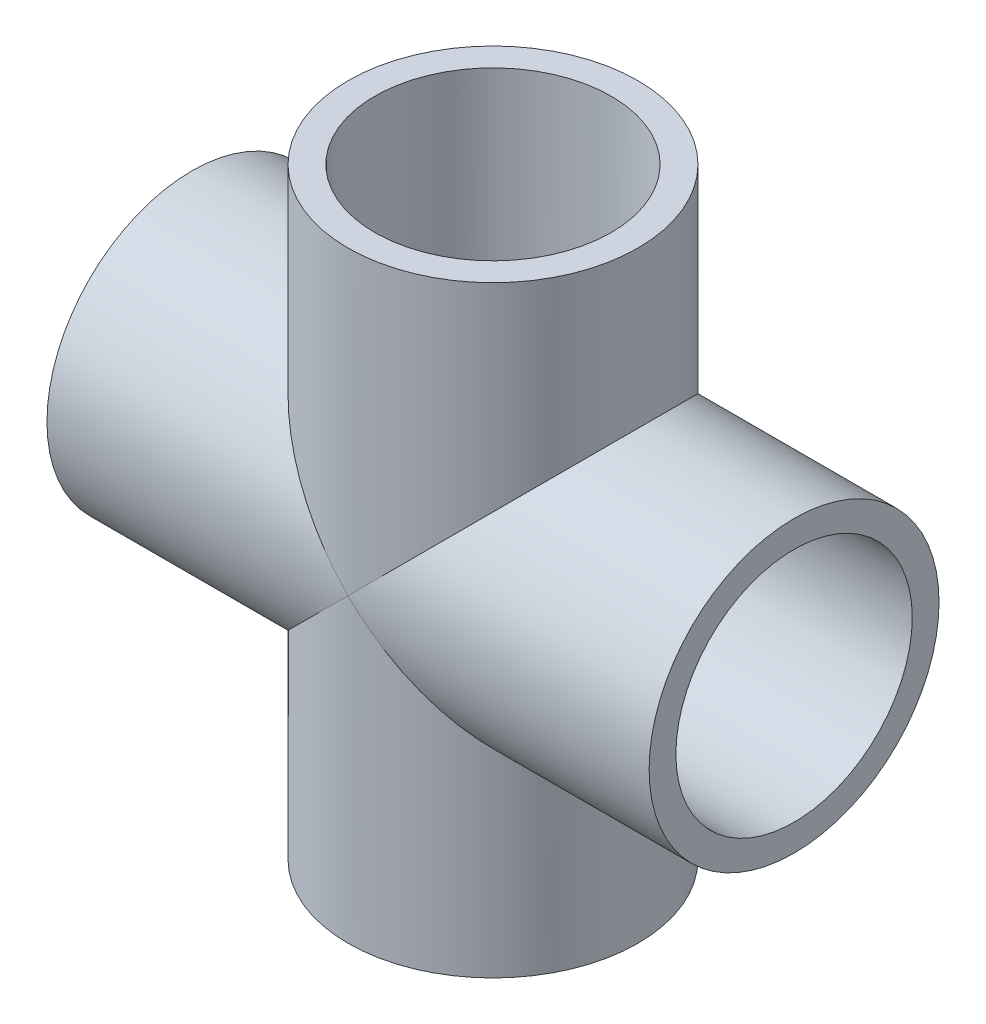
ISO-10303-21;
HEADER;
FILE_DESCRIPTION(('STEP AP214'),'2;1');
FILE_NAME('part.step','',(''),(''),'','','');
FILE_SCHEMA(('AUTOMOTIVE_DESIGN { 1 0 10303 214 1 1 1 1 }'));
ENDSEC;
DATA;
#1=APPLICATION_CONTEXT('core data for automotive mechanical design processes');
#2=APPLICATION_PROTOCOL_DEFINITION('international standard','automotive_design',2000,#1);
#3=PRODUCT_CONTEXT('',#1,'mechanical');
#4=PRODUCT('Part','Part','',(#3));
#5=PRODUCT_RELATED_PRODUCT_CATEGORY('part','',(#4));
#6=PRODUCT_DEFINITION_FORMATION('','',#4);
#7=PRODUCT_DEFINITION_CONTEXT('part definition',#1,'design');
#8=PRODUCT_DEFINITION('design','',#6,#7);
#9=PRODUCT_DEFINITION_SHAPE('','',#8);
#10=(LENGTH_UNIT() NAMED_UNIT(*) SI_UNIT(.MILLI.,.METRE.));
#11=(NAMED_UNIT(*) PLANE_ANGLE_UNIT() SI_UNIT($,.RADIAN.));
#12=(NAMED_UNIT(*) SI_UNIT($,.STERADIAN.) SOLID_ANGLE_UNIT());
#13=UNCERTAINTY_MEASURE_WITH_UNIT(LENGTH_MEASURE(1.E-05),#10,'distance_accuracy_value','');
#14=(GEOMETRIC_REPRESENTATION_CONTEXT(3) GLOBAL_UNCERTAINTY_ASSIGNED_CONTEXT((#13)) GLOBAL_UNIT_ASSIGNED_CONTEXT((#10,
#11,#12)) REPRESENTATION_CONTEXT('',''));
#15=CARTESIAN_POINT('',(0.,0.,0.));
#16=DIRECTION('',(0.,0.,1.));
#17=DIRECTION('',(1.,0.,0.));
#18=AXIS2_PLACEMENT_3D('',#15,#16,#17);
#19=CARTESIAN_POINT('',(0.,17.4625,0.));
#20=DIRECTION('',(0.,-1.,0.));
#21=DIRECTION('',(1.,0.,0.));
#22=AXIS2_PLACEMENT_3D('',#19,#20,#21);
#23=PLANE('',#22);
#24=CARTESIAN_POINT('',(0.,17.4625,0.));
#25=DIRECTION('',(0.,-1.,0.));
#26=DIRECTION('',(1.,0.,0.));
#27=AXIS2_PLACEMENT_3D('',#24,#25,#26);
#28=CIRCLE('',#27,16.637);
#29=CARTESIAN_POINT('',(16.637,17.4625,0.));
#30=VERTEX_POINT('',#29);
#31=EDGE_CURVE('E83',#30,#30,#28,.T.);
#32=ORIENTED_EDGE('',*,*,#31,.F.);
#33=EDGE_LOOP('',(#32));
#34=FACE_BOUND('',#33,.T.);
#35=CARTESIAN_POINT('',(0.,17.4625,0.));
#36=DIRECTION('',(0.,1.,0.));
#37=DIRECTION('',(-1.,0.,0.));
#38=AXIS2_PLACEMENT_3D('',#35,#36,#37);
#39=CIRCLE('',#38,13.3223);
#40=CARTESIAN_POINT('',(-13.3223,17.4625,0.));
#41=VERTEX_POINT('',#40);
#42=EDGE_CURVE('E127',#41,#41,#39,.T.);
#43=ORIENTED_EDGE('',*,*,#42,.F.);
#44=EDGE_LOOP('',(#43));
#45=FACE_BOUND('',#44,.T.);
#46=ADVANCED_FACE('F35',(#34,#45),#23,.F.);
#47=CARTESIAN_POINT('',(0.,-17.4625,0.));
#48=DIRECTION('',(0.,-1.,0.));
#49=DIRECTION('',(1.,0.,0.));
#50=AXIS2_PLACEMENT_3D('',#47,#48,#49);
#51=PLANE('',#50);
#52=CARTESIAN_POINT('',(0.,-17.4625,0.));
#53=DIRECTION('',(0.,1.,0.));
#54=DIRECTION('',(-1.,0.,0.));
#55=AXIS2_PLACEMENT_3D('',#52,#53,#54);
#56=CIRCLE('',#55,13.3223);
#57=CARTESIAN_POINT('',(-13.3223,-17.4625,0.));
#58=VERTEX_POINT('',#57);
#59=EDGE_CURVE('E130',#58,#58,#56,.T.);
#60=ORIENTED_EDGE('',*,*,#59,.T.);
#61=EDGE_LOOP('',(#60));
#62=FACE_BOUND('',#61,.T.);
#63=CARTESIAN_POINT('',(0.,-17.4625,0.));
#64=DIRECTION('',(0.,-1.,0.));
#65=DIRECTION('',(1.,0.,0.));
#66=AXIS2_PLACEMENT_3D('',#63,#64,#65);
#67=CIRCLE('',#66,16.637);
#68=CARTESIAN_POINT('',(16.637,-17.4625,0.));
#69=VERTEX_POINT('',#68);
#70=EDGE_CURVE('E118',#69,#69,#67,.T.);
#71=ORIENTED_EDGE('',*,*,#70,.T.);
#72=EDGE_LOOP('',(#71));
#73=FACE_BOUND('',#72,.T.);
#74=ADVANCED_FACE('F134',(#62,#73),#51,.T.);
#75=CARTESIAN_POINT('',(42.8625,0.,0.));
#76=DIRECTION('',(1.,0.,0.));
#77=DIRECTION('',(0.,0.,-1.));
#78=AXIS2_PLACEMENT_3D('',#75,#76,#77);
#79=CYLINDRICAL_SURFACE('',#78,13.3223);
#80=CARTESIAN_POINT('',(17.4625,0.,0.));
#81=DIRECTION('',(1.,0.,0.));
#82=DIRECTION('',(0.,0.,-1.));
#83=AXIS2_PLACEMENT_3D('',#80,#81,#82);
#84=CIRCLE('',#83,13.3223);
#85=CARTESIAN_POINT('',(17.4625,0.,-13.3223));
#86=VERTEX_POINT('',#85);
#87=EDGE_CURVE('E124',#86,#86,#84,.T.);
#88=ORIENTED_EDGE('',*,*,#87,.T.);
#89=EDGE_LOOP('',(#88));
#90=FACE_BOUND('',#89,.T.);
#91=CARTESIAN_POINT('',(0.,0.,0.));
#92=DIRECTION('',(0.707106781186548,-0.707106781186547,0.));
#93=DIRECTION('',(0.707106781186547,0.707106781186548,0.));
#94=AXIS2_PLACEMENT_3D('',#91,#92,#93);
#95=ELLIPSE('',#94,18.8405773420031,13.3223);
#96=CARTESIAN_POINT('',(0.,0.,13.3223));
#97=VERTEX_POINT('',#96);
#98=CARTESIAN_POINT('',(0.,0.,-13.3223));
#99=VERTEX_POINT('',#98);
#100=EDGE_CURVE('E48',#97,#99,#95,.F.);
#101=ORIENTED_EDGE('',*,*,#100,.T.);
#102=CARTESIAN_POINT('',(0.,0.,0.));
#103=DIRECTION('',(0.707106781186547,0.707106781186548,0.));
#104=DIRECTION('',(0.707106781186548,-0.707106781186547,0.));
#105=AXIS2_PLACEMENT_3D('',#102,#103,#104);
#106=ELLIPSE('',#105,18.8405773420031,13.3223);
#107=EDGE_CURVE('E11',#99,#97,#106,.F.);
#108=ORIENTED_EDGE('',*,*,#107,.T.);
#109=EDGE_LOOP('',(#101,#108));
#110=FACE_BOUND('',#109,.T.);
#111=ADVANCED_FACE('F75',(#90,#110),#79,.F.);
#112=CARTESIAN_POINT('',(-17.4625,0.,0.));
#113=DIRECTION('',(1.,0.,0.));
#114=DIRECTION('',(0.,0.,-1.));
#115=AXIS2_PLACEMENT_3D('',#112,#113,#114);
#116=CIRCLE('',#115,13.3223);
#117=CARTESIAN_POINT('',(-17.4625,0.,-13.3223));
#118=VERTEX_POINT('',#117);
#119=EDGE_CURVE('E121',#118,#118,#116,.T.);
#120=ORIENTED_EDGE('',*,*,#119,.F.);
#121=EDGE_LOOP('',(#120));
#122=FACE_BOUND('',#121,.T.);
#123=CARTESIAN_POINT('',(0.,0.,0.));
#124=DIRECTION('',(0.707106781186548,-0.707106781186547,0.));
#125=DIRECTION('',(0.707106781186547,0.707106781186548,0.));
#126=AXIS2_PLACEMENT_3D('',#123,#124,#125);
#127=ELLIPSE('',#126,18.8405773420031,13.3223);
#128=EDGE_CURVE('E65',#97,#99,#127,.T.);
#129=ORIENTED_EDGE('',*,*,#128,.T.);
#130=CARTESIAN_POINT('',(0.,0.,0.));
#131=DIRECTION('',(0.707106781186547,0.707106781186548,0.));
#132=DIRECTION('',(0.707106781186548,-0.707106781186547,0.));
#133=AXIS2_PLACEMENT_3D('',#130,#131,#132);
#134=ELLIPSE('',#133,18.8405773420031,13.3223);
#135=EDGE_CURVE('E43',#99,#97,#134,.T.);
#136=ORIENTED_EDGE('',*,*,#135,.T.);
#137=EDGE_LOOP('',(#129,#136));
#138=FACE_BOUND('',#137,.T.);
#139=ADVANCED_FACE('F76',(#122,#138),#79,.F.);
#140=CARTESIAN_POINT('',(-17.4625,0.,0.));
#141=DIRECTION('',(1.,0.,0.));
#142=DIRECTION('',(0.,0.,-1.));
#143=AXIS2_PLACEMENT_3D('',#140,#141,#142);
#144=PLANE('',#143);
#145=ORIENTED_EDGE('',*,*,#119,.T.);
#146=EDGE_LOOP('',(#145));
#147=FACE_BOUND('',#146,.T.);
#148=CARTESIAN_POINT('',(-17.4625,0.,0.));
#149=DIRECTION('',(-1.,0.,0.));
#150=DIRECTION('',(0.,0.,1.));
#151=AXIS2_PLACEMENT_3D('',#148,#149,#150);
#152=CIRCLE('',#151,16.637);
#153=CARTESIAN_POINT('',(-17.4625,0.,16.637));
#154=VERTEX_POINT('',#153);
#155=EDGE_CURVE('E95',#154,#154,#152,.T.);
#156=ORIENTED_EDGE('',*,*,#155,.T.);
#157=EDGE_LOOP('',(#156));
#158=FACE_BOUND('',#157,.T.);
#159=ADVANCED_FACE('F182',(#147,#158),#144,.F.);
#160=CARTESIAN_POINT('',(17.4625,0.,0.));
#161=DIRECTION('',(1.,0.,0.));
#162=DIRECTION('',(0.,0.,-1.));
#163=AXIS2_PLACEMENT_3D('',#160,#161,#162);
#164=PLANE('',#163);
#165=CARTESIAN_POINT('',(17.4625,0.,0.));
#166=DIRECTION('',(1.,0.,0.));
#167=DIRECTION('',(0.,0.,-1.));
#168=AXIS2_PLACEMENT_3D('',#165,#166,#167);
#169=CIRCLE('',#168,16.637);
#170=CARTESIAN_POINT('',(17.4625,0.,-16.637));
#171=VERTEX_POINT('',#170);
#172=EDGE_CURVE('E73',#171,#171,#169,.F.);
#173=ORIENTED_EDGE('',*,*,#172,.F.);
#174=EDGE_LOOP('',(#173));
#175=FACE_BOUND('',#174,.T.);
#176=ORIENTED_EDGE('',*,*,#87,.F.);
#177=EDGE_LOOP('',(#176));
#178=FACE_BOUND('',#177,.T.);
#179=ADVANCED_FACE('F178',(#175,#178),#164,.T.);
#180=CARTESIAN_POINT('',(17.4625,0.,0.));
#181=DIRECTION('',(-1.,0.,0.));
#182=DIRECTION('',(0.,0.,1.));
#183=AXIS2_PLACEMENT_3D('',#180,#181,#182);
#184=CYLINDRICAL_SURFACE('',#183,20.6375);
#185=CARTESIAN_POINT('',(42.8625,0.,0.));
#186=DIRECTION('',(-1.,0.,0.));
#187=DIRECTION('',(0.,0.,1.));
#188=AXIS2_PLACEMENT_3D('',#185,#186,#187);
#189=CIRCLE('',#188,20.6375);
#190=CARTESIAN_POINT('',(42.8625,0.,20.6375));
#191=VERTEX_POINT('',#190);
#192=EDGE_CURVE('E106',#191,#191,#189,.T.);
#193=ORIENTED_EDGE('',*,*,#192,.T.);
#194=EDGE_LOOP('',(#193));
#195=FACE_BOUND('',#194,.T.);
#196=CARTESIAN_POINT('',(0.,0.,0.));
#197=DIRECTION('',(-0.707106781186547,-0.707106781186547,0.));
#198=DIRECTION('',(-0.707106781186547,0.707106781186547,0.));
#199=AXIS2_PLACEMENT_3D('',#196,#197,#198);
#200=ELLIPSE('',#199,29.1858323934748,20.6375);
#201=CARTESIAN_POINT('',(0.,0.,-20.6375));
#202=VERTEX_POINT('',#201);
#203=CARTESIAN_POINT('',(0.,0.,20.6375));
#204=VERTEX_POINT('',#203);
#205=EDGE_CURVE('E110',#202,#204,#200,.T.);
#206=ORIENTED_EDGE('',*,*,#205,.F.);
#207=CARTESIAN_POINT('',(0.,0.,0.));
#208=DIRECTION('',(0.707106781186547,-0.707106781186548,0.));
#209=DIRECTION('',(-0.707106781186547,-0.707106781186547,0.));
#210=AXIS2_PLACEMENT_3D('',#207,#208,#209);
#211=ELLIPSE('',#210,29.1858323934747,20.6375);
#212=EDGE_CURVE('E101',#202,#204,#211,.T.);
#213=ORIENTED_EDGE('',*,*,#212,.T.);
#214=EDGE_LOOP('',(#206,#213));
#215=FACE_BOUND('',#214,.T.);
#216=ADVANCED_FACE('F181',(#195,#215),#184,.T.);
#217=CARTESIAN_POINT('',(-42.8625,0.,0.));
#218=DIRECTION('',(-1.,0.,0.));
#219=DIRECTION('',(0.,0.,1.));
#220=AXIS2_PLACEMENT_3D('',#217,#218,#219);
#221=CIRCLE('',#220,20.6375);
#222=CARTESIAN_POINT('',(-42.8625,0.,20.6375));
#223=VERTEX_POINT('',#222);
#224=EDGE_CURVE('E98',#223,#223,#221,.T.);
#225=ORIENTED_EDGE('',*,*,#224,.F.);
#226=EDGE_LOOP('',(#225));
#227=FACE_BOUND('',#226,.T.);
#228=CARTESIAN_POINT('',(0.,0.,0.));
#229=DIRECTION('',(-0.707106781186547,-0.707106781186547,0.));
#230=DIRECTION('',(0.707106781186547,-0.707106781186548,0.));
#231=AXIS2_PLACEMENT_3D('',#228,#229,#230);
#232=ELLIPSE('',#231,29.1858323934747,20.6375);
#233=EDGE_CURVE('E89',#204,#202,#232,.T.);
#234=ORIENTED_EDGE('',*,*,#233,.T.);
#235=CARTESIAN_POINT('',(0.,0.,0.));
#236=DIRECTION('',(-0.707106781186547,0.707106781186547,0.));
#237=DIRECTION('',(-0.707106781186547,-0.707106781186547,0.));
#238=AXIS2_PLACEMENT_3D('',#235,#236,#237);
#239=ELLIPSE('',#238,29.1858323934748,20.6375);
#240=EDGE_CURVE('E55',#204,#202,#239,.F.);
#241=ORIENTED_EDGE('',*,*,#240,.F.);
#242=EDGE_LOOP('',(#234,#241));
#243=FACE_BOUND('',#242,.T.);
#244=ADVANCED_FACE('F172',(#227,#243),#184,.T.);
#245=CARTESIAN_POINT('',(-17.4625,0.,0.));
#246=DIRECTION('',(-1.,0.,0.));
#247=DIRECTION('',(0.,0.,1.));
#248=AXIS2_PLACEMENT_3D('',#245,#246,#247);
#249=CONICAL_SURFACE('',#248,16.637,0.00749985937974589);
#250=CARTESIAN_POINT('',(-42.8625,0.,0.));
#251=DIRECTION('',(-1.,0.,0.));
#252=DIRECTION('',(0.,0.,1.));
#253=AXIS2_PLACEMENT_3D('',#250,#251,#252);
#254=CIRCLE('',#253,16.8275);
#255=CARTESIAN_POINT('',(-42.8625,0.,16.8275));
#256=VERTEX_POINT('',#255);
#257=EDGE_CURVE('E92',#256,#256,#254,.T.);
#258=ORIENTED_EDGE('',*,*,#257,.T.);
#259=EDGE_LOOP('',(#258));
#260=FACE_BOUND('',#259,.T.);
#261=ORIENTED_EDGE('',*,*,#155,.F.);
#262=EDGE_LOOP('',(#261));
#263=FACE_BOUND('',#262,.T.);
#264=ADVANCED_FACE('F164',(#260,#263),#249,.F.);
#265=CARTESIAN_POINT('',(42.8625,0.,0.));
#266=DIRECTION('',(1.,0.,0.));
#267=DIRECTION('',(0.,0.,-1.));
#268=AXIS2_PLACEMENT_3D('',#265,#266,#267);
#269=CONICAL_SURFACE('',#268,16.8275,0.00749985937974562);
#270=CARTESIAN_POINT('',(42.8625,0.,0.));
#271=DIRECTION('',(-1.,0.,0.));
#272=DIRECTION('',(0.,0.,1.));
#273=AXIS2_PLACEMENT_3D('',#270,#271,#272);
#274=CIRCLE('',#273,16.8275);
#275=CARTESIAN_POINT('',(42.8625,0.,16.8275));
#276=VERTEX_POINT('',#275);
#277=EDGE_CURVE('E103',#276,#276,#274,.T.);
#278=ORIENTED_EDGE('',*,*,#277,.F.);
#279=EDGE_LOOP('',(#278));
#280=FACE_BOUND('',#279,.T.);
#281=ORIENTED_EDGE('',*,*,#172,.T.);
#282=EDGE_LOOP('',(#281));
#283=FACE_BOUND('',#282,.T.);
#284=ADVANCED_FACE('F160',(#280,#283),#269,.F.);
#285=CARTESIAN_POINT('',(0.,42.8625,0.));
#286=DIRECTION('',(0.,1.,0.));
#287=DIRECTION('',(-1.,0.,0.));
#288=AXIS2_PLACEMENT_3D('',#285,#286,#287);
#289=CONICAL_SURFACE('',#288,16.8275,0.00749985937974589);
#290=CARTESIAN_POINT('',(0.,42.8625,0.));
#291=DIRECTION('',(0.,-1.,0.));
#292=DIRECTION('',(1.,0.,0.));
#293=AXIS2_PLACEMENT_3D('',#290,#291,#292);
#294=CIRCLE('',#293,16.8275);
#295=CARTESIAN_POINT('',(16.8275,42.8625,0.));
#296=VERTEX_POINT('',#295);
#297=EDGE_CURVE('E86',#296,#296,#294,.T.);
#298=ORIENTED_EDGE('',*,*,#297,.F.);
#299=EDGE_LOOP('',(#298));
#300=FACE_BOUND('',#299,.T.);
#301=ORIENTED_EDGE('',*,*,#31,.T.);
#302=EDGE_LOOP('',(#301));
#303=FACE_BOUND('',#302,.T.);
#304=ADVANCED_FACE('F163',(#300,#303),#289,.F.);
#305=CARTESIAN_POINT('',(20.6375,42.8625,0.));
#306=DIRECTION('',(0.,1.,0.));
#307=DIRECTION('',(-1.,0.,0.));
#308=AXIS2_PLACEMENT_3D('',#305,#306,#307);
#309=PLANE('',#308);
#310=ORIENTED_EDGE('',*,*,#297,.T.);
#311=EDGE_LOOP('',(#310));
#312=FACE_BOUND('',#311,.T.);
#313=CARTESIAN_POINT('',(0.,42.8625,0.));
#314=DIRECTION('',(0.,-1.,0.));
#315=DIRECTION('',(1.,0.,0.));
#316=AXIS2_PLACEMENT_3D('',#313,#314,#315);
#317=CIRCLE('',#316,20.6375);
#318=CARTESIAN_POINT('',(20.6375,42.8625,0.));
#319=VERTEX_POINT('',#318);
#320=EDGE_CURVE('E80',#319,#319,#317,.T.);
#321=ORIENTED_EDGE('',*,*,#320,.F.);
#322=EDGE_LOOP('',(#321));
#323=FACE_BOUND('',#322,.T.);
#324=ADVANCED_FACE('F37',(#312,#323),#309,.T.);
#325=CARTESIAN_POINT('',(0.,0.,0.));
#326=DIRECTION('',(0.,-1.,0.));
#327=DIRECTION('',(1.,0.,0.));
#328=AXIS2_PLACEMENT_3D('',#325,#326,#327);
#329=CYLINDRICAL_SURFACE('',#328,20.6375);
#330=ORIENTED_EDGE('',*,*,#212,.F.);
#331=ORIENTED_EDGE('',*,*,#233,.F.);
#332=EDGE_LOOP('',(#330,#331));
#333=FACE_BOUND('',#332,.T.);
#334=ORIENTED_EDGE('',*,*,#320,.T.);
#335=EDGE_LOOP('',(#334));
#336=FACE_BOUND('',#335,.T.);
#337=ADVANCED_FACE('F176',(#333,#336),#329,.T.);
#338=CARTESIAN_POINT('',(-42.8625,-20.6375,0.));
#339=DIRECTION('',(-1.,0.,0.));
#340=DIRECTION('',(0.,0.,1.));
#341=AXIS2_PLACEMENT_3D('',#338,#339,#340);
#342=PLANE('',#341);
#343=ORIENTED_EDGE('',*,*,#224,.T.);
#344=EDGE_LOOP('',(#343));
#345=FACE_BOUND('',#344,.T.);
#346=ORIENTED_EDGE('',*,*,#257,.F.);
#347=EDGE_LOOP('',(#346));
#348=FACE_BOUND('',#347,.T.);
#349=ADVANCED_FACE('F168',(#345,#348),#342,.T.);
#350=CARTESIAN_POINT('',(42.8625,-20.6375,0.));
#351=DIRECTION('',(1.,0.,0.));
#352=DIRECTION('',(0.,0.,-1.));
#353=AXIS2_PLACEMENT_3D('',#350,#351,#352);
#354=PLANE('',#353);
#355=ORIENTED_EDGE('',*,*,#277,.T.);
#356=EDGE_LOOP('',(#355));
#357=FACE_BOUND('',#356,.T.);
#358=ORIENTED_EDGE('',*,*,#192,.F.);
#359=EDGE_LOOP('',(#358));
#360=FACE_BOUND('',#359,.T.);
#361=ADVANCED_FACE('F159',(#357,#360),#354,.T.);
#362=CARTESIAN_POINT('',(0.,-17.4625,0.));
#363=DIRECTION('',(0.,1.,0.));
#364=DIRECTION('',(-1.,0.,0.));
#365=AXIS2_PLACEMENT_3D('',#362,#363,#364);
#366=CYLINDRICAL_SURFACE('',#365,20.6375);
#367=ORIENTED_EDGE('',*,*,#205,.T.);
#368=ORIENTED_EDGE('',*,*,#240,.T.);
#369=EDGE_LOOP('',(#367,#368));
#370=FACE_BOUND('',#369,.T.);
#371=CARTESIAN_POINT('',(0.,-42.8625,0.));
#372=DIRECTION('',(0.,-1.,0.));
#373=DIRECTION('',(1.,0.,0.));
#374=AXIS2_PLACEMENT_3D('',#371,#372,#373);
#375=CIRCLE('',#374,20.6375);
#376=CARTESIAN_POINT('',(20.6375,-42.8625,0.));
#377=VERTEX_POINT('',#376);
#378=EDGE_CURVE('E112',#377,#377,#375,.T.);
#379=ORIENTED_EDGE('',*,*,#378,.F.);
#380=EDGE_LOOP('',(#379));
#381=FACE_BOUND('',#380,.T.);
#382=ADVANCED_FACE('F155',(#370,#381),#366,.T.);
#383=CARTESIAN_POINT('',(0.,-17.4625,0.));
#384=DIRECTION('',(0.,-1.,0.));
#385=DIRECTION('',(1.,0.,0.));
#386=AXIS2_PLACEMENT_3D('',#383,#384,#385);
#387=CONICAL_SURFACE('',#386,16.637,0.00749985937974616);
#388=CARTESIAN_POINT('',(0.,-42.8625,0.));
#389=DIRECTION('',(0.,-1.,0.));
#390=DIRECTION('',(1.,0.,0.));
#391=AXIS2_PLACEMENT_3D('',#388,#389,#390);
#392=CIRCLE('',#391,16.8275);
#393=CARTESIAN_POINT('',(16.8275,-42.8625,0.));
#394=VERTEX_POINT('',#393);
#395=EDGE_CURVE('E115',#394,#394,#392,.T.);
#396=ORIENTED_EDGE('',*,*,#395,.T.);
#397=EDGE_LOOP('',(#396));
#398=FACE_BOUND('',#397,.T.);
#399=ORIENTED_EDGE('',*,*,#70,.F.);
#400=EDGE_LOOP('',(#399));
#401=FACE_BOUND('',#400,.T.);
#402=ADVANCED_FACE('F158',(#398,#401),#387,.F.);
#403=CARTESIAN_POINT('',(20.6375,-42.8625,0.));
#404=DIRECTION('',(0.,-1.,0.));
#405=DIRECTION('',(1.,0.,0.));
#406=AXIS2_PLACEMENT_3D('',#403,#404,#405);
#407=PLANE('',#406);
#408=ORIENTED_EDGE('',*,*,#378,.T.);
#409=EDGE_LOOP('',(#408));
#410=FACE_BOUND('',#409,.T.);
#411=ORIENTED_EDGE('',*,*,#395,.F.);
#412=EDGE_LOOP('',(#411));
#413=FACE_BOUND('',#412,.T.);
#414=ADVANCED_FACE('F141',(#410,#413),#407,.T.);
#415=CARTESIAN_POINT('',(0.,42.8625,0.));
#416=DIRECTION('',(0.,1.,0.));
#417=DIRECTION('',(-1.,0.,0.));
#418=AXIS2_PLACEMENT_3D('',#415,#416,#417);
#419=CYLINDRICAL_SURFACE('',#418,13.3223);
#420=ORIENTED_EDGE('',*,*,#42,.T.);
#421=EDGE_LOOP('',(#420));
#422=FACE_BOUND('',#421,.T.);
#423=ORIENTED_EDGE('',*,*,#100,.F.);
#424=ORIENTED_EDGE('',*,*,#135,.F.);
#425=EDGE_LOOP('',(#423,#424));
#426=FACE_BOUND('',#425,.T.);
#427=ADVANCED_FACE('F72',(#422,#426),#419,.F.);
#428=ORIENTED_EDGE('',*,*,#128,.F.);
#429=ORIENTED_EDGE('',*,*,#107,.F.);
#430=EDGE_LOOP('',(#428,#429));
#431=FACE_BOUND('',#430,.T.);
#432=ORIENTED_EDGE('',*,*,#59,.F.);
#433=EDGE_LOOP('',(#432));
#434=FACE_BOUND('',#433,.T.);
#435=ADVANCED_FACE('F66',(#431,#434),#419,.F.);
#436=CLOSED_SHELL('',(#46,#74,#111,#139,#159,#179,#216,#244,#264,#284,#304,#324,#337,#349,#361,
#382,#402,#414,#427,#435));
#437=MANIFOLD_SOLID_BREP('B2',#436);
#438=ADVANCED_BREP_SHAPE_REPRESENTATION('',(#18,#437),#14);
#439=SHAPE_DEFINITION_REPRESENTATION(#9,#438);
ENDSEC;
END-ISO-10303-21;
